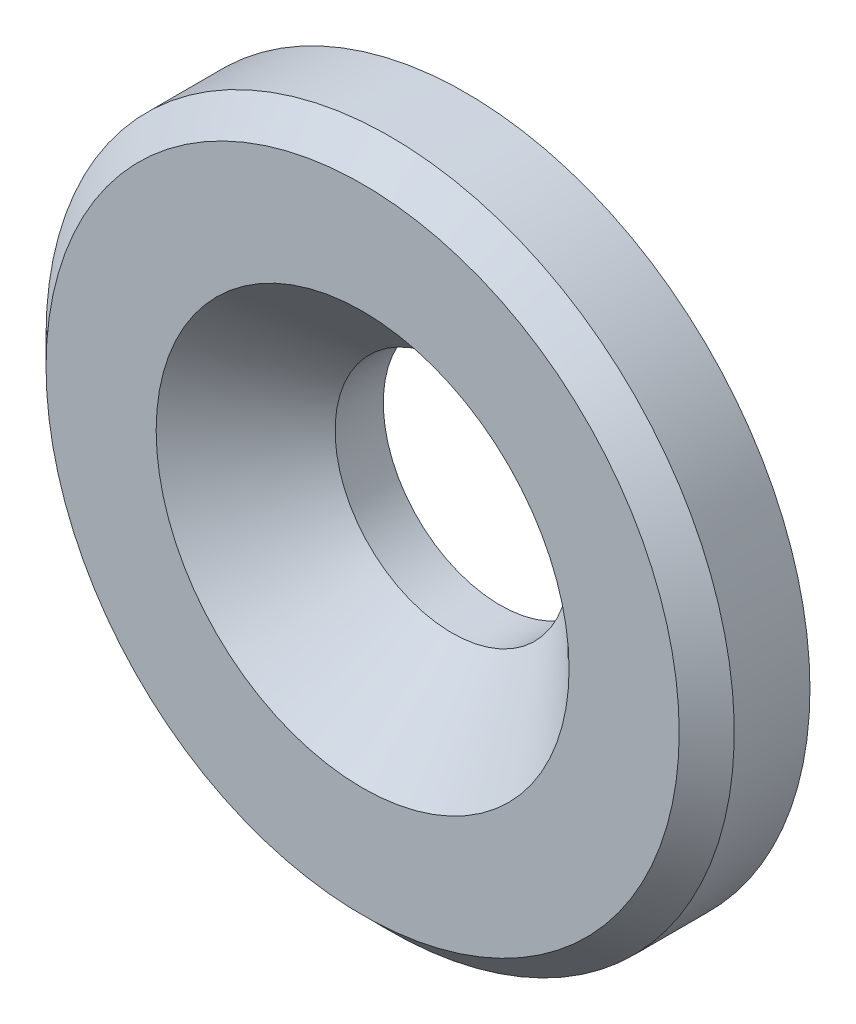
ISO-10303-21;
HEADER;
FILE_DESCRIPTION(('STEP AP214'),'2;1');
FILE_NAME('part.step','',(''),(''),'','','');
FILE_SCHEMA(('AUTOMOTIVE_DESIGN { 1 0 10303 214 1 1 1 1 }'));
ENDSEC;
DATA;
#1=APPLICATION_CONTEXT('core data for automotive mechanical design processes');
#2=APPLICATION_PROTOCOL_DEFINITION('international standard','automotive_design',2000,#1);
#3=PRODUCT_CONTEXT('',#1,'mechanical');
#4=PRODUCT('Part','Part','',(#3));
#5=PRODUCT_RELATED_PRODUCT_CATEGORY('part','',(#4));
#6=PRODUCT_DEFINITION_FORMATION('','',#4);
#7=PRODUCT_DEFINITION_CONTEXT('part definition',#1,'design');
#8=PRODUCT_DEFINITION('design','',#6,#7);
#9=PRODUCT_DEFINITION_SHAPE('','',#8);
#10=(LENGTH_UNIT() NAMED_UNIT(*) SI_UNIT(.MILLI.,.METRE.));
#11=(NAMED_UNIT(*) PLANE_ANGLE_UNIT() SI_UNIT($,.RADIAN.));
#12=(NAMED_UNIT(*) SI_UNIT($,.STERADIAN.) SOLID_ANGLE_UNIT());
#13=UNCERTAINTY_MEASURE_WITH_UNIT(LENGTH_MEASURE(1.E-05),#10,'distance_accuracy_value','');
#14=(GEOMETRIC_REPRESENTATION_CONTEXT(3) GLOBAL_UNCERTAINTY_ASSIGNED_CONTEXT((#13)) GLOBAL_UNIT_ASSIGNED_CONTEXT((#10,
#11,#12)) REPRESENTATION_CONTEXT('',''));
#15=CARTESIAN_POINT('',(0.,0.,0.));
#16=DIRECTION('',(0.,0.,1.));
#17=DIRECTION('',(1.,0.,0.));
#18=AXIS2_PLACEMENT_3D('',#15,#16,#17);
#19=CARTESIAN_POINT('',(0.,0.,0.5));
#20=DIRECTION('',(0.,0.,-1.));
#21=DIRECTION('',(-1.,0.,0.));
#22=AXIS2_PLACEMENT_3D('',#19,#20,#21);
#23=CYLINDRICAL_SURFACE('',#22,3.5);
#24=CARTESIAN_POINT('',(0.,0.,0.5));
#25=DIRECTION('',(0.,0.,1.));
#26=DIRECTION('',(1.,0.,0.));
#27=AXIS2_PLACEMENT_3D('',#24,#25,#26);
#28=CIRCLE('',#27,3.5);
#29=CARTESIAN_POINT('',(3.5,0.,0.5));
#30=VERTEX_POINT('',#29);
#31=EDGE_CURVE('E52',#30,#30,#28,.T.);
#32=ORIENTED_EDGE('',*,*,#31,.F.);
#33=EDGE_LOOP('',(#32));
#34=FACE_BOUND('',#33,.T.);
#35=CARTESIAN_POINT('',(0.,0.,0.));
#36=DIRECTION('',(0.,0.,1.));
#37=DIRECTION('',(1.,0.,0.));
#38=AXIS2_PLACEMENT_3D('',#35,#36,#37);
#39=CIRCLE('',#38,3.5);
#40=CARTESIAN_POINT('',(3.5,0.,0.));
#41=VERTEX_POINT('',#40);
#42=EDGE_CURVE('E56',#41,#41,#39,.T.);
#43=ORIENTED_EDGE('',*,*,#42,.T.);
#44=EDGE_LOOP('',(#43));
#45=FACE_BOUND('',#44,.T.);
#46=ADVANCED_FACE('F40',(#34,#45),#23,.T.);
#47=CARTESIAN_POINT('',(0.,0.,0.));
#48=DIRECTION('',(0.,0.,1.));
#49=DIRECTION('',(1.,0.,0.));
#50=AXIS2_PLACEMENT_3D('',#47,#48,#49);
#51=PLANE('',#50);
#52=CARTESIAN_POINT('',(0.,0.,0.));
#53=DIRECTION('',(0.,0.,1.));
#54=DIRECTION('',(1.,0.,0.));
#55=AXIS2_PLACEMENT_3D('',#52,#53,#54);
#56=CIRCLE('',#55,1.7);
#57=CARTESIAN_POINT('',(1.7,0.,0.));
#58=VERTEX_POINT('',#57);
#59=EDGE_CURVE('E67',#58,#58,#56,.T.);
#60=ORIENTED_EDGE('',*,*,#59,.T.);
#61=EDGE_LOOP('',(#60));
#62=FACE_BOUND('',#61,.T.);
#63=ORIENTED_EDGE('',*,*,#42,.F.);
#64=EDGE_LOOP('',(#63));
#65=FACE_BOUND('',#64,.T.);
#66=ADVANCED_FACE('F93',(#62,#65),#51,.F.);
#67=CARTESIAN_POINT('',(0.,0.,2.));
#68=DIRECTION('',(0.,0.,-1.));
#69=DIRECTION('',(-1.,0.,0.));
#70=AXIS2_PLACEMENT_3D('',#67,#68,#69);
#71=CYLINDRICAL_SURFACE('',#70,5.);
#72=CARTESIAN_POINT('',(0.,0.,1.6));
#73=DIRECTION('',(0.,0.,1.));
#74=DIRECTION('',(1.,0.,0.));
#75=AXIS2_PLACEMENT_3D('',#72,#73,#74);
#76=CIRCLE('',#75,5.);
#77=CARTESIAN_POINT('',(-5.,0.,1.6));
#78=VERTEX_POINT('',#77);
#79=EDGE_CURVE('E10',#78,#78,#76,.F.);
#80=ORIENTED_EDGE('',*,*,#79,.T.);
#81=EDGE_LOOP('',(#80));
#82=FACE_BOUND('',#81,.T.);
#83=CARTESIAN_POINT('',(0.,0.,0.5));
#84=DIRECTION('',(0.,0.,1.));
#85=DIRECTION('',(1.,0.,0.));
#86=AXIS2_PLACEMENT_3D('',#83,#84,#85);
#87=CIRCLE('',#86,5.);
#88=CARTESIAN_POINT('',(5.,0.,0.5));
#89=VERTEX_POINT('',#88);
#90=EDGE_CURVE('E60',#89,#89,#87,.T.);
#91=ORIENTED_EDGE('',*,*,#90,.T.);
#92=EDGE_LOOP('',(#91));
#93=FACE_BOUND('',#92,.T.);
#94=ADVANCED_FACE('F85',(#82,#93),#71,.T.);
#95=CARTESIAN_POINT('',(0.,0.,2.));
#96=DIRECTION('',(0.,0.,1.));
#97=DIRECTION('',(1.,0.,0.));
#98=AXIS2_PLACEMENT_3D('',#95,#96,#97);
#99=PLANE('',#98);
#100=CARTESIAN_POINT('',(0.,0.,2.));
#101=DIRECTION('',(0.,0.,1.));
#102=DIRECTION('',(1.,0.,0.));
#103=AXIS2_PLACEMENT_3D('',#100,#101,#102);
#104=CIRCLE('',#103,3.);
#105=CARTESIAN_POINT('',(3.,0.,2.));
#106=VERTEX_POINT('',#105);
#107=EDGE_CURVE('E64',#106,#106,#104,.T.);
#108=ORIENTED_EDGE('',*,*,#107,.F.);
#109=EDGE_LOOP('',(#108));
#110=FACE_BOUND('',#109,.T.);
#111=CARTESIAN_POINT('',(0.,0.,2.));
#112=DIRECTION('',(0.,0.,1.));
#113=DIRECTION('',(1.,0.,0.));
#114=AXIS2_PLACEMENT_3D('',#111,#112,#113);
#115=CIRCLE('',#114,4.6);
#116=CARTESIAN_POINT('',(-4.6,0.,2.));
#117=VERTEX_POINT('',#116);
#118=EDGE_CURVE('E48',#117,#117,#115,.T.);
#119=ORIENTED_EDGE('',*,*,#118,.T.);
#120=EDGE_LOOP('',(#119));
#121=FACE_BOUND('',#120,.T.);
#122=ADVANCED_FACE('F82',(#110,#121),#99,.T.);
#123=CARTESIAN_POINT('',(0.,0.,0.5));
#124=DIRECTION('',(0.,0.,1.));
#125=DIRECTION('',(1.,0.,0.));
#126=AXIS2_PLACEMENT_3D('',#123,#124,#125);
#127=PLANE('',#126);
#128=ORIENTED_EDGE('',*,*,#31,.T.);
#129=EDGE_LOOP('',(#128));
#130=FACE_BOUND('',#129,.T.);
#131=ORIENTED_EDGE('',*,*,#90,.F.);
#132=EDGE_LOOP('',(#131));
#133=FACE_BOUND('',#132,.T.);
#134=ADVANCED_FACE('F84',(#130,#133),#127,.F.);
#135=CARTESIAN_POINT('',(0.,0.,2.));
#136=DIRECTION('',(0.,0.,-1.));
#137=DIRECTION('',(-1.,0.,0.));
#138=AXIS2_PLACEMENT_3D('',#135,#136,#137);
#139=CONICAL_SURFACE('',#138,4.6,0.785398163397445);
#140=CARTESIAN_POINT('',(-5.,0.,1.6));
#141=CARTESIAN_POINT('',(-4.99583333333333,0.,1.60416666666667));
#142=CARTESIAN_POINT('',(-4.99166666666667,0.,1.60833333333333));
#143=CARTESIAN_POINT('',(-4.98333333333333,0.,1.61666666666667));
#144=CARTESIAN_POINT('',(-4.97916666666667,0.,1.62083333333333));
#145=CARTESIAN_POINT('',(-4.97083333333333,0.,1.62916666666667));
#146=CARTESIAN_POINT('',(-4.96666666666667,0.,1.63333333333333));
#147=CARTESIAN_POINT('',(-4.95833333333333,0.,1.64166666666667));
#148=CARTESIAN_POINT('',(-4.95416666666667,0.,1.64583333333333));
#149=CARTESIAN_POINT('',(-4.94583333333333,0.,1.65416666666667));
#150=CARTESIAN_POINT('',(-4.94166666666667,0.,1.65833333333333));
#151=CARTESIAN_POINT('',(-4.93333333333333,0.,1.66666666666667));
#152=CARTESIAN_POINT('',(-4.92916666666667,0.,1.67083333333333));
#153=CARTESIAN_POINT('',(-4.92083333333333,0.,1.67916666666667));
#154=CARTESIAN_POINT('',(-4.91666666666667,0.,1.68333333333333));
#155=CARTESIAN_POINT('',(-4.90833333333333,0.,1.69166666666667));
#156=CARTESIAN_POINT('',(-4.90416666666667,0.,1.69583333333333));
#157=CARTESIAN_POINT('',(-4.89583333333333,0.,1.70416666666667));
#158=CARTESIAN_POINT('',(-4.89166666666667,0.,1.70833333333333));
#159=CARTESIAN_POINT('',(-4.88333333333333,0.,1.71666666666667));
#160=CARTESIAN_POINT('',(-4.87916666666667,0.,1.72083333333333));
#161=CARTESIAN_POINT('',(-4.87083333333333,0.,1.72916666666667));
#162=CARTESIAN_POINT('',(-4.86666666666667,0.,1.73333333333333));
#163=CARTESIAN_POINT('',(-4.85833333333334,0.,1.74166666666667));
#164=CARTESIAN_POINT('',(-4.85416666666667,0.,1.74583333333333));
#165=CARTESIAN_POINT('',(-4.84583333333333,0.,1.75416666666667));
#166=CARTESIAN_POINT('',(-4.84166666666667,0.,1.75833333333333));
#167=CARTESIAN_POINT('',(-4.83333333333334,0.,1.76666666666667));
#168=CARTESIAN_POINT('',(-4.82916666666667,0.,1.77083333333333));
#169=CARTESIAN_POINT('',(-4.82083333333333,0.,1.77916666666667));
#170=CARTESIAN_POINT('',(-4.81666666666667,0.,1.78333333333333));
#171=CARTESIAN_POINT('',(-4.80833333333334,0.,1.79166666666667));
#172=CARTESIAN_POINT('',(-4.80416666666667,0.,1.79583333333333));
#173=CARTESIAN_POINT('',(-4.79583333333334,0.,1.80416666666667));
#174=CARTESIAN_POINT('',(-4.79166666666667,0.,1.80833333333333));
#175=CARTESIAN_POINT('',(-4.78333333333334,0.,1.81666666666667));
#176=CARTESIAN_POINT('',(-4.77916666666667,0.,1.82083333333333));
#177=CARTESIAN_POINT('',(-4.77083333333334,0.,1.82916666666667));
#178=CARTESIAN_POINT('',(-4.76666666666667,0.,1.83333333333333));
#179=CARTESIAN_POINT('',(-4.75833333333334,0.,1.84166666666667));
#180=CARTESIAN_POINT('',(-4.75416666666667,0.,1.84583333333333));
#181=CARTESIAN_POINT('',(-4.74583333333334,0.,1.85416666666667));
#182=CARTESIAN_POINT('',(-4.74166666666667,0.,1.85833333333333));
#183=CARTESIAN_POINT('',(-4.73333333333334,0.,1.86666666666667));
#184=CARTESIAN_POINT('',(-4.72916666666667,0.,1.87083333333333));
#185=CARTESIAN_POINT('',(-4.72083333333334,0.,1.87916666666667));
#186=CARTESIAN_POINT('',(-4.71666666666667,0.,1.88333333333333));
#187=CARTESIAN_POINT('',(-4.70833333333334,0.,1.89166666666667));
#188=CARTESIAN_POINT('',(-4.70416666666667,0.,1.89583333333333));
#189=CARTESIAN_POINT('',(-4.69583333333334,0.,1.90416666666667));
#190=CARTESIAN_POINT('',(-4.69166666666667,0.,1.90833333333333));
#191=CARTESIAN_POINT('',(-4.68333333333334,0.,1.91666666666667));
#192=CARTESIAN_POINT('',(-4.67916666666667,0.,1.92083333333333));
#193=CARTESIAN_POINT('',(-4.67083333333334,0.,1.92916666666667));
#194=CARTESIAN_POINT('',(-4.66666666666667,0.,1.93333333333333));
#195=CARTESIAN_POINT('',(-4.65833333333334,0.,1.94166666666667));
#196=CARTESIAN_POINT('',(-4.65416666666667,0.,1.94583333333333));
#197=CARTESIAN_POINT('',(-4.64583333333334,0.,1.95416666666667));
#198=CARTESIAN_POINT('',(-4.64166666666667,0.,1.95833333333333));
#199=CARTESIAN_POINT('',(-4.63333333333334,0.,1.96666666666667));
#200=CARTESIAN_POINT('',(-4.62916666666667,0.,1.97083333333333));
#201=CARTESIAN_POINT('',(-4.62083333333334,0.,1.97916666666667));
#202=CARTESIAN_POINT('',(-4.61666666666667,0.,1.98333333333333));
#203=CARTESIAN_POINT('',(-4.60833333333334,0.,1.99166666666667));
#204=CARTESIAN_POINT('',(-4.60416666666667,0.,1.99583333333333));
#205=CARTESIAN_POINT('',(-4.6,0.,2.));
#206=B_SPLINE_CURVE_WITH_KNOTS('',3,(#140,#141,#142,#143,#144,#145,#146,#147,#148,#149,#150,
#151,#152,#153,#154,#155,#156,#157,#158,#159,#160,#161,#162,#163,#164,#165,#166,#167,#168,#169,
#170,#171,#172,#173,#174,#175,#176,#177,#178,#179,#180,#181,#182,#183,#184,#185,#186,#187,#188,
#189,#190,#191,#192,#193,#194,#195,#196,#197,#198,#199,#200,#201,#202,#203,#204,#205),
.UNSPECIFIED.,.F.,.F.,(4,2,2,2,2,2,2,2,2,2,2,2,2,2,2,2,2,2,2,2,2,2,2,2,2,2,2,2,2,2,2,2,4),(0.,
0.0176776695296634,0.0353553390593273,0.0530330085889906,0.0707106781186545,0.0883883476483178,
0.106066017177982,0.123743686707645,0.141421356237308,0.159099025766972,0.176776695296636,
0.1944543648263,0.212132034355963,0.229809703885627,0.24748737341529,0.265165042944954,
0.282842712474617,0.300520382004281,0.318198051533945,0.335875721063608,0.353553390593272,
0.371231060122936,0.388908729652599,0.406586399182263,0.424264068711926,0.441941738241589,
0.459619407771254,0.477297077300917,0.494974746830581,0.512652416360244,0.530330085889908,
0.548007755419571,0.565685424949235),.UNSPECIFIED.);
#207=EDGE_CURVE('BSEAM43',#78,#117,#206,.T.);
#208=ORIENTED_EDGE('',*,*,#79,.F.);
#209=ORIENTED_EDGE('',*,*,#118,.F.);
#210=ORIENTED_EDGE('',*,*,#207,.T.);
#211=ORIENTED_EDGE('',*,*,#207,.F.);
#212=EDGE_LOOP('',(#208,#210,#209,#211));
#213=FACE_BOUND('',#212,.T.);
#214=ADVANCED_FACE('F43',(#213),#139,.T.);
#215=CARTESIAN_POINT('',(0.,0.,2.));
#216=DIRECTION('',(0.,0.,1.));
#217=DIRECTION('',(1.,0.,0.));
#218=AXIS2_PLACEMENT_3D('',#215,#216,#217);
#219=CONICAL_SURFACE('',#218,3.,0.785398163397448);
#220=CARTESIAN_POINT('',(0.,0.,0.7));
#221=DIRECTION('',(0.,0.,1.));
#222=DIRECTION('',(1.,0.,0.));
#223=AXIS2_PLACEMENT_3D('',#220,#221,#222);
#224=CIRCLE('',#223,1.7);
#225=CARTESIAN_POINT('',(1.7,0.,0.7));
#226=VERTEX_POINT('',#225);
#227=EDGE_CURVE('E70',#226,#226,#224,.T.);
#228=ORIENTED_EDGE('',*,*,#227,.F.);
#229=EDGE_LOOP('',(#228));
#230=FACE_BOUND('',#229,.T.);
#231=ORIENTED_EDGE('',*,*,#107,.T.);
#232=EDGE_LOOP('',(#231));
#233=FACE_BOUND('',#232,.T.);
#234=ADVANCED_FACE('F76',(#230,#233),#219,.F.);
#235=CARTESIAN_POINT('',(0.,0.,2.));
#236=DIRECTION('',(0.,0.,1.));
#237=DIRECTION('',(1.,0.,0.));
#238=AXIS2_PLACEMENT_3D('',#235,#236,#237);
#239=CYLINDRICAL_SURFACE('',#238,1.7);
#240=ORIENTED_EDGE('',*,*,#59,.F.);
#241=EDGE_LOOP('',(#240));
#242=FACE_BOUND('',#241,.T.);
#243=ORIENTED_EDGE('',*,*,#227,.T.);
#244=EDGE_LOOP('',(#243));
#245=FACE_BOUND('',#244,.T.);
#246=ADVANCED_FACE('F74',(#242,#245),#239,.F.);
#247=CLOSED_SHELL('',(#46,#66,#94,#122,#134,#214,#234,#246));
#248=MANIFOLD_SOLID_BREP('B2',#247);
#249=ADVANCED_BREP_SHAPE_REPRESENTATION('',(#18,#248),#14);
#250=SHAPE_DEFINITION_REPRESENTATION(#9,#249);
ENDSEC;
END-ISO-10303-21;
